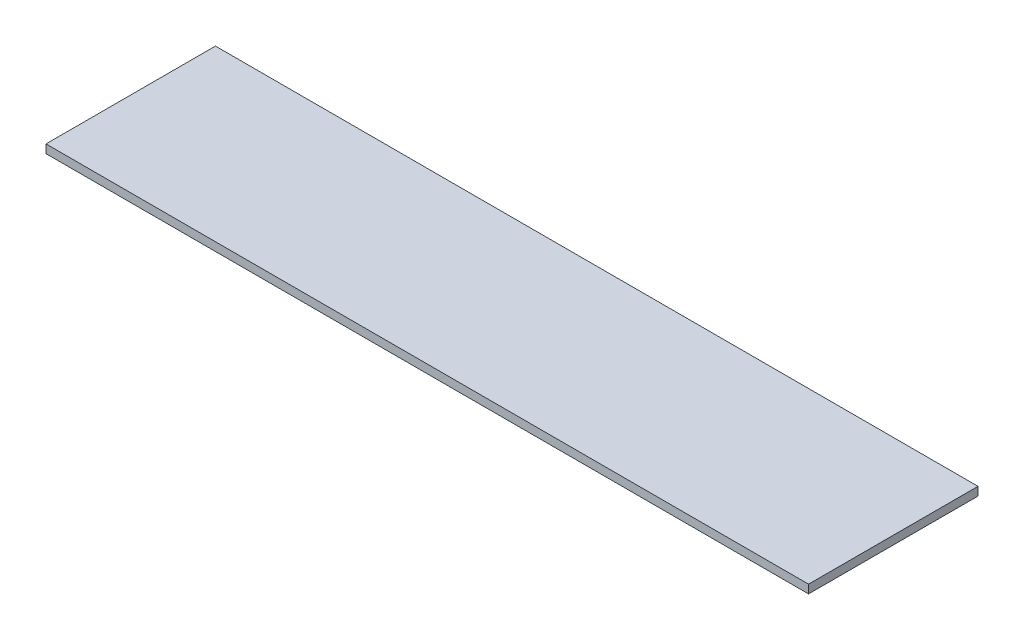
ISO-10303-21;
HEADER;
FILE_DESCRIPTION(('STEP AP214'),'2;1');
FILE_NAME('part.step','',(''),(''),'','','');
FILE_SCHEMA(('AUTOMOTIVE_DESIGN { 1 0 10303 214 1 1 1 1 }'));
ENDSEC;
DATA;
#1=APPLICATION_CONTEXT('core data for automotive mechanical design processes');
#2=APPLICATION_PROTOCOL_DEFINITION('international standard','automotive_design',2000,#1);
#3=PRODUCT_CONTEXT('',#1,'mechanical');
#4=PRODUCT('Part','Part','',(#3));
#5=PRODUCT_RELATED_PRODUCT_CATEGORY('part','',(#4));
#6=PRODUCT_DEFINITION_FORMATION('','',#4);
#7=PRODUCT_DEFINITION_CONTEXT('part definition',#1,'design');
#8=PRODUCT_DEFINITION('design','',#6,#7);
#9=PRODUCT_DEFINITION_SHAPE('','',#8);
#10=(LENGTH_UNIT() NAMED_UNIT(*) SI_UNIT(.MILLI.,.METRE.));
#11=(NAMED_UNIT(*) PLANE_ANGLE_UNIT() SI_UNIT($,.RADIAN.));
#12=(NAMED_UNIT(*) SI_UNIT($,.STERADIAN.) SOLID_ANGLE_UNIT());
#13=UNCERTAINTY_MEASURE_WITH_UNIT(LENGTH_MEASURE(1.E-05),#10,'distance_accuracy_value','');
#14=(GEOMETRIC_REPRESENTATION_CONTEXT(3) GLOBAL_UNCERTAINTY_ASSIGNED_CONTEXT((#13)) GLOBAL_UNIT_ASSIGNED_CONTEXT((#10,
#11,#12)) REPRESENTATION_CONTEXT('',''));
#15=CARTESIAN_POINT('',(0.,0.,0.));
#16=DIRECTION('',(0.,0.,1.));
#17=DIRECTION('',(1.,0.,0.));
#18=AXIS2_PLACEMENT_3D('',#15,#16,#17);
#19=CARTESIAN_POINT('',(0.,10.,100.));
#20=DIRECTION('',(1.,0.,0.));
#21=DIRECTION('',(0.,0.,-1.));
#22=AXIS2_PLACEMENT_3D('',#19,#20,#21);
#23=PLANE('',#22);
#24=DIRECTION('',(0.,0.,1.));
#25=VECTOR('',#24,1.);
#26=CARTESIAN_POINT('',(0.,0.,100.));
#27=LINE('',#26,#25);
#28=CARTESIAN_POINT('',(0.,0.,-100.));
#29=VERTEX_POINT('',#28);
#30=CARTESIAN_POINT('',(0.,0.,100.));
#31=VERTEX_POINT('',#30);
#32=EDGE_CURVE('E97',#29,#31,#27,.T.);
#33=ORIENTED_EDGE('',*,*,#32,.T.);
#34=DIRECTION('',(0.,-1.,0.));
#35=VECTOR('',#34,1.);
#36=CARTESIAN_POINT('',(0.,10.,100.));
#37=LINE('',#36,#35);
#38=CARTESIAN_POINT('',(0.,10.,100.));
#39=VERTEX_POINT('',#38);
#40=EDGE_CURVE('E11',#39,#31,#37,.T.);
#41=ORIENTED_EDGE('',*,*,#40,.F.);
#42=DIRECTION('',(0.,0.,1.));
#43=VECTOR('',#42,1.);
#44=CARTESIAN_POINT('',(0.,10.,100.));
#45=LINE('',#44,#43);
#46=CARTESIAN_POINT('',(0.,10.,-100.));
#47=VERTEX_POINT('',#46);
#48=EDGE_CURVE('E85',#47,#39,#45,.T.);
#49=ORIENTED_EDGE('',*,*,#48,.F.);
#50=DIRECTION('',(0.,-1.,0.));
#51=VECTOR('',#50,1.);
#52=CARTESIAN_POINT('',(0.,10.,-100.));
#53=LINE('',#52,#51);
#54=EDGE_CURVE('E93',#47,#29,#53,.T.);
#55=ORIENTED_EDGE('',*,*,#54,.T.);
#56=EDGE_LOOP('',(#33,#41,#49,#55));
#57=FACE_BOUND('',#56,.T.);
#58=ADVANCED_FACE('F34',(#57),#23,.F.);
#59=CARTESIAN_POINT('',(0.,10.,100.));
#60=DIRECTION('',(0.,0.,-1.));
#61=DIRECTION('',(-1.,0.,0.));
#62=AXIS2_PLACEMENT_3D('',#59,#60,#61);
#63=PLANE('',#62);
#64=DIRECTION('',(1.,0.,0.));
#65=VECTOR('',#64,1.);
#66=CARTESIAN_POINT('',(0.,0.,100.));
#67=LINE('',#66,#65);
#68=CARTESIAN_POINT('',(900.,0.,100.));
#69=VERTEX_POINT('',#68);
#70=EDGE_CURVE('E89',#31,#69,#67,.T.);
#71=ORIENTED_EDGE('',*,*,#70,.T.);
#72=DIRECTION('',(0.,-1.,0.));
#73=VECTOR('',#72,1.);
#74=CARTESIAN_POINT('',(900.,10.,100.));
#75=LINE('',#74,#73);
#76=CARTESIAN_POINT('',(900.,10.,100.));
#77=VERTEX_POINT('',#76);
#78=EDGE_CURVE('E42',#77,#69,#75,.T.);
#79=ORIENTED_EDGE('',*,*,#78,.F.);
#80=DIRECTION('',(1.,0.,0.));
#81=VECTOR('',#80,1.);
#82=CARTESIAN_POINT('',(0.,10.,100.));
#83=LINE('',#82,#81);
#84=EDGE_CURVE('E80',#39,#77,#83,.T.);
#85=ORIENTED_EDGE('',*,*,#84,.F.);
#86=ORIENTED_EDGE('',*,*,#40,.T.);
#87=EDGE_LOOP('',(#71,#79,#85,#86));
#88=FACE_BOUND('',#87,.T.);
#89=ADVANCED_FACE('F88',(#88),#63,.F.);
#90=CARTESIAN_POINT('',(900.,10.,100.));
#91=DIRECTION('',(-1.,0.,0.));
#92=DIRECTION('',(0.,0.,1.));
#93=AXIS2_PLACEMENT_3D('',#90,#91,#92);
#94=PLANE('',#93);
#95=DIRECTION('',(0.,0.,-1.));
#96=VECTOR('',#95,1.);
#97=CARTESIAN_POINT('',(900.,0.,100.));
#98=LINE('',#97,#96);
#99=CARTESIAN_POINT('',(900.,0.,-100.));
#100=VERTEX_POINT('',#99);
#101=EDGE_CURVE('E67',#69,#100,#98,.T.);
#102=ORIENTED_EDGE('',*,*,#101,.T.);
#103=DIRECTION('',(0.,-1.,0.));
#104=VECTOR('',#103,1.);
#105=CARTESIAN_POINT('',(900.,10.,-100.));
#106=LINE('',#105,#104);
#107=CARTESIAN_POINT('',(900.,10.,-100.));
#108=VERTEX_POINT('',#107);
#109=EDGE_CURVE('E90',#108,#100,#106,.T.);
#110=ORIENTED_EDGE('',*,*,#109,.F.);
#111=DIRECTION('',(0.,0.,-1.));
#112=VECTOR('',#111,1.);
#113=CARTESIAN_POINT('',(900.,10.,100.));
#114=LINE('',#113,#112);
#115=EDGE_CURVE('E83',#77,#108,#114,.T.);
#116=ORIENTED_EDGE('',*,*,#115,.F.);
#117=ORIENTED_EDGE('',*,*,#78,.T.);
#118=EDGE_LOOP('',(#102,#110,#116,#117));
#119=FACE_BOUND('',#118,.T.);
#120=ADVANCED_FACE('F91',(#119),#94,.F.);
#121=CARTESIAN_POINT('',(0.,10.,-100.));
#122=DIRECTION('',(0.,0.,1.));
#123=DIRECTION('',(1.,0.,0.));
#124=AXIS2_PLACEMENT_3D('',#121,#122,#123);
#125=PLANE('',#124);
#126=DIRECTION('',(-1.,0.,0.));
#127=VECTOR('',#126,1.);
#128=CARTESIAN_POINT('',(0.,0.,-100.));
#129=LINE('',#128,#127);
#130=EDGE_CURVE('E73',#100,#29,#129,.T.);
#131=ORIENTED_EDGE('',*,*,#130,.T.);
#132=ORIENTED_EDGE('',*,*,#54,.F.);
#133=DIRECTION('',(-1.,0.,0.));
#134=VECTOR('',#133,1.);
#135=CARTESIAN_POINT('',(0.,10.,-100.));
#136=LINE('',#135,#134);
#137=EDGE_CURVE('E50',#108,#47,#136,.T.);
#138=ORIENTED_EDGE('',*,*,#137,.F.);
#139=ORIENTED_EDGE('',*,*,#109,.T.);
#140=EDGE_LOOP('',(#131,#132,#138,#139));
#141=FACE_BOUND('',#140,.T.);
#142=ADVANCED_FACE('F104',(#141),#125,.F.);
#143=CARTESIAN_POINT('',(0.,10.,-100.));
#144=DIRECTION('',(0.,-1.,0.));
#145=DIRECTION('',(0.,0.,-1.));
#146=AXIS2_PLACEMENT_3D('',#143,#144,#145);
#147=PLANE('',#146);
#148=ORIENTED_EDGE('',*,*,#48,.T.);
#149=ORIENTED_EDGE('',*,*,#84,.T.);
#150=ORIENTED_EDGE('',*,*,#115,.T.);
#151=ORIENTED_EDGE('',*,*,#137,.T.);
#152=EDGE_LOOP('',(#148,#149,#150,#151));
#153=FACE_BOUND('',#152,.T.);
#154=ADVANCED_FACE('F81',(#153),#147,.F.);
#155=CARTESIAN_POINT('',(0.,0.,-100.));
#156=DIRECTION('',(0.,-1.,0.));
#157=DIRECTION('',(0.,0.,-1.));
#158=AXIS2_PLACEMENT_3D('',#155,#156,#157);
#159=PLANE('',#158);
#160=ORIENTED_EDGE('',*,*,#32,.F.);
#161=ORIENTED_EDGE('',*,*,#130,.F.);
#162=ORIENTED_EDGE('',*,*,#101,.F.);
#163=ORIENTED_EDGE('',*,*,#70,.F.);
#164=EDGE_LOOP('',(#160,#161,#162,#163));
#165=FACE_BOUND('',#164,.T.);
#166=ADVANCED_FACE('F107',(#165),#159,.T.);
#167=CLOSED_SHELL('',(#58,#89,#120,#142,#154,#166));
#168=MANIFOLD_SOLID_BREP('B2',#167);
#169=ADVANCED_BREP_SHAPE_REPRESENTATION('',(#18,#168),#14);
#170=SHAPE_DEFINITION_REPRESENTATION(#9,#169);
ENDSEC;
END-ISO-10303-21;
